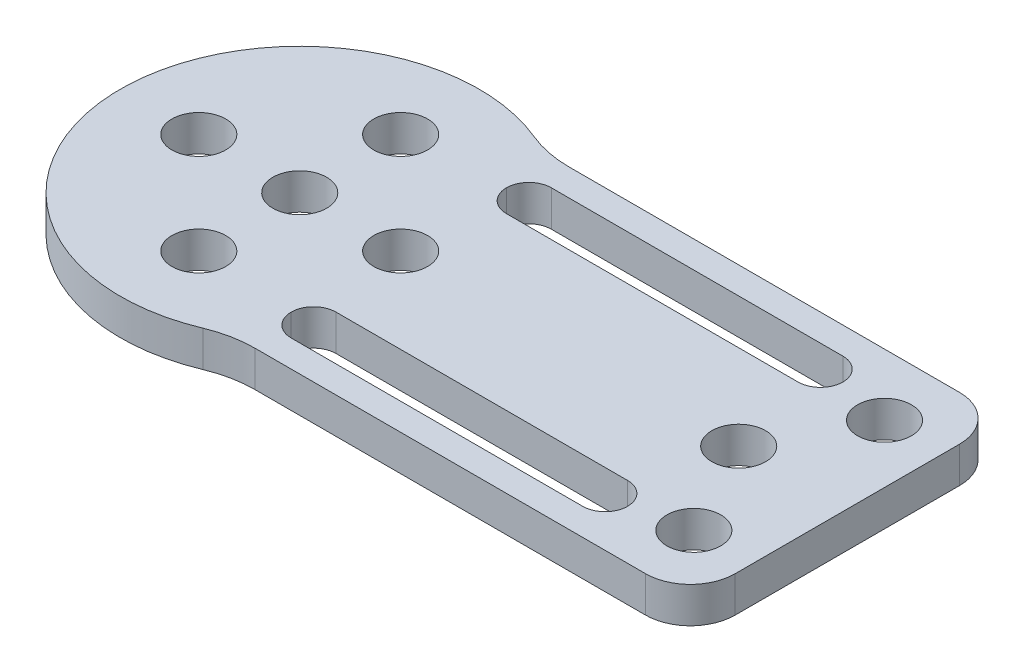
ISO-10303-21;
HEADER;
FILE_DESCRIPTION(('STEP AP214'),'2;1');
FILE_NAME('part.step','',(''),(''),'','','');
FILE_SCHEMA(('AUTOMOTIVE_DESIGN { 1 0 10303 214 1 1 1 1 }'));
ENDSEC;
DATA;
#1=APPLICATION_CONTEXT('core data for automotive mechanical design processes');
#2=APPLICATION_PROTOCOL_DEFINITION('international standard','automotive_design',2000,#1);
#3=PRODUCT_CONTEXT('',#1,'mechanical');
#4=PRODUCT('Part','Part','',(#3));
#5=PRODUCT_RELATED_PRODUCT_CATEGORY('part','',(#4));
#6=PRODUCT_DEFINITION_FORMATION('','',#4);
#7=PRODUCT_DEFINITION_CONTEXT('part definition',#1,'design');
#8=PRODUCT_DEFINITION('design','',#6,#7);
#9=PRODUCT_DEFINITION_SHAPE('','',#8);
#10=(LENGTH_UNIT() NAMED_UNIT(*) SI_UNIT(.MILLI.,.METRE.));
#11=(NAMED_UNIT(*) PLANE_ANGLE_UNIT() SI_UNIT($,.RADIAN.));
#12=(NAMED_UNIT(*) SI_UNIT($,.STERADIAN.) SOLID_ANGLE_UNIT());
#13=UNCERTAINTY_MEASURE_WITH_UNIT(LENGTH_MEASURE(1.E-05),#10,'distance_accuracy_value','');
#14=(GEOMETRIC_REPRESENTATION_CONTEXT(3) GLOBAL_UNCERTAINTY_ASSIGNED_CONTEXT((#13)) GLOBAL_UNIT_ASSIGNED_CONTEXT((#10,
#11,#12)) REPRESENTATION_CONTEXT('',''));
#15=CARTESIAN_POINT('',(0.,0.,0.));
#16=DIRECTION('',(0.,0.,1.));
#17=DIRECTION('',(1.,0.,0.));
#18=AXIS2_PLACEMENT_3D('',#15,#16,#17);
#19=CARTESIAN_POINT('',(11.716387939251,0.8,7.));
#20=DIRECTION('',(-1.,0.,0.));
#21=DIRECTION('',(0.,0.,1.));
#22=AXIS2_PLACEMENT_3D('',#19,#20,#21);
#23=PLANE('',#22);
#24=DIRECTION('',(0.,0.,-1.));
#25=VECTOR('',#24,1.);
#26=CARTESIAN_POINT('',(11.716387939251,-0.8,7.));
#27=LINE('',#26,#25);
#28=CARTESIAN_POINT('',(11.716387939251,-0.8,5.));
#29=VERTEX_POINT('',#28);
#30=CARTESIAN_POINT('',(11.716387939251,-0.8,-5.));
#31=VERTEX_POINT('',#30);
#32=EDGE_CURVE('E199',#29,#31,#27,.T.);
#33=ORIENTED_EDGE('',*,*,#32,.T.);
#34=DIRECTION('',(0.,-1.,0.));
#35=VECTOR('',#34,1.);
#36=CARTESIAN_POINT('',(11.716387939251,0.8,-5.));
#37=LINE('',#36,#35);
#38=CARTESIAN_POINT('',(11.716387939251,0.8,-5.));
#39=VERTEX_POINT('',#38);
#40=EDGE_CURVE('E177',#31,#39,#37,.F.);
#41=ORIENTED_EDGE('',*,*,#40,.T.);
#42=DIRECTION('',(0.,0.,-1.));
#43=VECTOR('',#42,1.);
#44=CARTESIAN_POINT('',(11.716387939251,0.8,7.));
#45=LINE('',#44,#43);
#46=CARTESIAN_POINT('',(11.716387939251,0.8,5.));
#47=VERTEX_POINT('',#46);
#48=EDGE_CURVE('E208',#47,#39,#45,.T.);
#49=ORIENTED_EDGE('',*,*,#48,.F.);
#50=DIRECTION('',(0.,-1.,0.));
#51=VECTOR('',#50,1.);
#52=CARTESIAN_POINT('',(11.716387939251,0.8,5.));
#53=LINE('',#52,#51);
#54=EDGE_CURVE('E182',#47,#29,#53,.T.);
#55=ORIENTED_EDGE('',*,*,#54,.T.);
#56=EDGE_LOOP('',(#33,#41,#49,#55));
#57=FACE_BOUND('',#56,.T.);
#58=ADVANCED_FACE('F33',(#57),#23,.F.);
#59=CARTESIAN_POINT('',(11.716387939251,0.8,-7.));
#60=DIRECTION('',(0.,0.,1.));
#61=DIRECTION('',(1.,0.,0.));
#62=AXIS2_PLACEMENT_3D('',#59,#60,#61);
#63=PLANE('',#62);
#64=DIRECTION('',(-1.,0.,0.));
#65=VECTOR('',#64,1.);
#66=CARTESIAN_POINT('',(11.716387939251,-0.8,-7.));
#67=LINE('',#66,#65);
#68=CARTESIAN_POINT('',(9.71638793925096,-0.8,-7.));
#69=VERTEX_POINT('',#68);
#70=CARTESIAN_POINT('',(-7.7,-0.8,-7.));
#71=VERTEX_POINT('',#70);
#72=EDGE_CURVE('E189',#69,#71,#67,.T.);
#73=ORIENTED_EDGE('',*,*,#72,.T.);
#74=DIRECTION('',(0.,1.,0.));
#75=VECTOR('',#74,1.);
#76=CARTESIAN_POINT('',(-7.7,0.8,-7.));
#77=LINE('',#76,#75);
#78=CARTESIAN_POINT('',(-7.7,0.8,-7.));
#79=VERTEX_POINT('',#78);
#80=EDGE_CURVE('E227',#71,#79,#77,.T.);
#81=ORIENTED_EDGE('',*,*,#80,.T.);
#82=DIRECTION('',(-1.,0.,0.));
#83=VECTOR('',#82,1.);
#84=CARTESIAN_POINT('',(11.716387939251,0.8,-7.));
#85=LINE('',#84,#83);
#86=CARTESIAN_POINT('',(9.71638793925096,0.8,-7.));
#87=VERTEX_POINT('',#86);
#88=EDGE_CURVE('E192',#87,#79,#85,.T.);
#89=ORIENTED_EDGE('',*,*,#88,.F.);
#90=DIRECTION('',(0.,-1.,0.));
#91=VECTOR('',#90,1.);
#92=CARTESIAN_POINT('',(9.71638793925096,0.8,-7.));
#93=LINE('',#92,#91);
#94=EDGE_CURVE('E176',#87,#69,#93,.T.);
#95=ORIENTED_EDGE('',*,*,#94,.T.);
#96=EDGE_LOOP('',(#73,#81,#89,#95));
#97=FACE_BOUND('',#96,.T.);
#98=ADVANCED_FACE('F188',(#97),#63,.F.);
#99=CARTESIAN_POINT('',(-12.7,0.8,0.));
#100=DIRECTION('',(0.,-1.,0.));
#101=DIRECTION('',(0.,0.,-1.));
#102=AXIS2_PLACEMENT_3D('',#99,#100,#101);
#103=CYLINDRICAL_SURFACE('',#102,8.);
#104=CARTESIAN_POINT('',(-12.7,0.8,0.));
#105=DIRECTION('',(0.,1.,0.));
#106=DIRECTION('',(0.,0.,1.));
#107=AXIS2_PLACEMENT_3D('',#104,#105,#106);
#108=CIRCLE('',#107,8.);
#109=CARTESIAN_POINT('',(-9.62307692307692,0.8,-7.38461538461539));
#110=VERTEX_POINT('',#109);
#111=CARTESIAN_POINT('',(-9.62307692307694,0.8,7.38461538461538));
#112=VERTEX_POINT('',#111);
#113=EDGE_CURVE('E383',#110,#112,#108,.T.);
#114=ORIENTED_EDGE('',*,*,#113,.F.);
#115=DIRECTION('',(0.,-1.,0.));
#116=VECTOR('',#115,1.);
#117=CARTESIAN_POINT('',(-9.62307692307692,0.8,-7.38461538461539));
#118=LINE('',#117,#116);
#119=CARTESIAN_POINT('',(-9.62307692307692,-0.8,-7.38461538461539));
#120=VERTEX_POINT('',#119);
#121=EDGE_CURVE('E224',#110,#120,#118,.T.);
#122=ORIENTED_EDGE('',*,*,#121,.T.);
#123=CARTESIAN_POINT('',(-12.7,-0.8,0.));
#124=DIRECTION('',(0.,1.,0.));
#125=DIRECTION('',(0.,0.,1.));
#126=AXIS2_PLACEMENT_3D('',#123,#124,#125);
#127=CIRCLE('',#126,8.);
#128=CARTESIAN_POINT('',(-9.62307692307694,-0.8,7.38461538461538));
#129=VERTEX_POINT('',#128);
#130=EDGE_CURVE('E198',#120,#129,#127,.T.);
#131=ORIENTED_EDGE('',*,*,#130,.T.);
#132=DIRECTION('',(0.,-1.,0.));
#133=VECTOR('',#132,1.);
#134=CARTESIAN_POINT('',(-9.62307692307694,0.8,7.38461538461538));
#135=LINE('',#134,#133);
#136=EDGE_CURVE('E222',#129,#112,#135,.F.);
#137=ORIENTED_EDGE('',*,*,#136,.T.);
#138=EDGE_LOOP('',(#114,#122,#131,#137));
#139=FACE_BOUND('',#138,.T.);
#140=ADVANCED_FACE('F404',(#139),#103,.T.);
#141=CARTESIAN_POINT('',(-8.8270166537926,0.8,7.));
#142=DIRECTION('',(0.,0.,-1.));
#143=DIRECTION('',(-1.,0.,0.));
#144=AXIS2_PLACEMENT_3D('',#141,#142,#143);
#145=PLANE('',#144);
#146=DIRECTION('',(1.,0.,0.));
#147=VECTOR('',#146,1.);
#148=CARTESIAN_POINT('',(-8.8270166537926,0.8,7.));
#149=LINE('',#148,#147);
#150=CARTESIAN_POINT('',(-7.70000000000002,0.8,7.));
#151=VERTEX_POINT('',#150);
#152=CARTESIAN_POINT('',(9.71638793925096,0.8,7.));
#153=VERTEX_POINT('',#152);
#154=EDGE_CURVE('E193',#151,#153,#149,.T.);
#155=ORIENTED_EDGE('',*,*,#154,.F.);
#156=DIRECTION('',(0.,1.,0.));
#157=VECTOR('',#156,1.);
#158=CARTESIAN_POINT('',(-7.70000000000002,-0.8,7.));
#159=LINE('',#158,#157);
#160=CARTESIAN_POINT('',(-7.70000000000002,-0.8,7.));
#161=VERTEX_POINT('',#160);
#162=EDGE_CURVE('E229',#151,#161,#159,.F.);
#163=ORIENTED_EDGE('',*,*,#162,.T.);
#164=DIRECTION('',(1.,0.,0.));
#165=VECTOR('',#164,1.);
#166=CARTESIAN_POINT('',(-8.8270166537926,-0.8,7.));
#167=LINE('',#166,#165);
#168=CARTESIAN_POINT('',(9.71638793925096,-0.8,7.));
#169=VERTEX_POINT('',#168);
#170=EDGE_CURVE('E202',#161,#169,#167,.T.);
#171=ORIENTED_EDGE('',*,*,#170,.T.);
#172=DIRECTION('',(0.,-1.,0.));
#173=VECTOR('',#172,1.);
#174=CARTESIAN_POINT('',(9.71638793925096,0.8,7.));
#175=LINE('',#174,#173);
#176=EDGE_CURVE('E219',#169,#153,#175,.F.);
#177=ORIENTED_EDGE('',*,*,#176,.T.);
#178=EDGE_LOOP('',(#155,#163,#171,#177));
#179=FACE_BOUND('',#178,.T.);
#180=ADVANCED_FACE('F394',(#179),#145,.F.);
#181=CARTESIAN_POINT('',(-12.7,0.8,0.));
#182=DIRECTION('',(0.,1.,0.));
#183=DIRECTION('',(0.,0.,1.));
#184=AXIS2_PLACEMENT_3D('',#181,#182,#183);
#185=PLANE('',#184);
#186=CARTESIAN_POINT('',(-7.28361206074903,0.8,-4.8));
#187=DIRECTION('',(0.,1.,0.));
#188=DIRECTION('',(0.,0.,1.));
#189=AXIS2_PLACEMENT_3D('',#186,#187,#188);
#190=CIRCLE('',#189,1.);
#191=CARTESIAN_POINT('',(-7.28361206074903,0.8,-3.8));
#192=VERTEX_POINT('',#191);
#193=CARTESIAN_POINT('',(-8.28361206074904,0.8,-4.8));
#194=VERTEX_POINT('',#193);
#195=EDGE_CURVE('E275',#192,#194,#190,.F.);
#196=ORIENTED_EDGE('',*,*,#195,.T.);
#197=CARTESIAN_POINT('',(-7.28361206074903,0.8,-4.8));
#198=DIRECTION('',(0.,1.,0.));
#199=DIRECTION('',(0.,0.,1.));
#200=AXIS2_PLACEMENT_3D('',#197,#198,#199);
#201=CIRCLE('',#200,1.);
#202=CARTESIAN_POINT('',(-7.28361206074903,0.8,-5.8));
#203=VERTEX_POINT('',#202);
#204=EDGE_CURVE('E42',#194,#203,#201,.F.);
#205=ORIENTED_EDGE('',*,*,#204,.T.);
#206=DIRECTION('',(-1.,0.,0.));
#207=VECTOR('',#206,1.);
#208=CARTESIAN_POINT('',(-8.28361206074904,0.8,-5.8));
#209=LINE('',#208,#207);
#210=CARTESIAN_POINT('',(5.71638793925096,0.8,-5.8));
#211=VERTEX_POINT('',#210);
#212=EDGE_CURVE('E319',#211,#203,#209,.T.);
#213=ORIENTED_EDGE('',*,*,#212,.F.);
#214=CARTESIAN_POINT('',(5.71638793925096,0.8,-4.8));
#215=DIRECTION('',(0.,1.,0.));
#216=DIRECTION('',(0.,0.,1.));
#217=AXIS2_PLACEMENT_3D('',#214,#215,#216);
#218=CIRCLE('',#217,1.);
#219=CARTESIAN_POINT('',(6.71638793925096,0.8,-4.8));
#220=VERTEX_POINT('',#219);
#221=EDGE_CURVE('E58',#211,#220,#218,.F.);
#222=ORIENTED_EDGE('',*,*,#221,.T.);
#223=CARTESIAN_POINT('',(5.71638793925096,0.8,-4.8));
#224=DIRECTION('',(0.,1.,0.));
#225=DIRECTION('',(0.,0.,1.));
#226=AXIS2_PLACEMENT_3D('',#223,#224,#225);
#227=CIRCLE('',#226,1.);
#228=CARTESIAN_POINT('',(5.71638793925096,0.8,-3.8));
#229=VERTEX_POINT('',#228);
#230=EDGE_CURVE('E279',#220,#229,#227,.F.);
#231=ORIENTED_EDGE('',*,*,#230,.T.);
#232=DIRECTION('',(1.,0.,0.));
#233=VECTOR('',#232,1.);
#234=CARTESIAN_POINT('',(-8.28361206074904,0.8,-3.8));
#235=LINE('',#234,#233);
#236=EDGE_CURVE('E322',#192,#229,#235,.T.);
#237=ORIENTED_EDGE('',*,*,#236,.F.);
#238=EDGE_LOOP('',(#196,#205,#213,#222,#231,#237));
#239=FACE_BOUND('',#238,.T.);
#240=CARTESIAN_POINT('',(-7.28361206074904,0.8,4.8));
#241=DIRECTION('',(0.,1.,0.));
#242=DIRECTION('',(0.,0.,1.));
#243=AXIS2_PLACEMENT_3D('',#240,#241,#242);
#244=CIRCLE('',#243,1.);
#245=CARTESIAN_POINT('',(-7.28361206074904,0.8,5.8));
#246=VERTEX_POINT('',#245);
#247=CARTESIAN_POINT('',(-8.28361206074904,0.8,4.8));
#248=VERTEX_POINT('',#247);
#249=EDGE_CURVE('E259',#246,#248,#244,.F.);
#250=ORIENTED_EDGE('',*,*,#249,.T.);
#251=CARTESIAN_POINT('',(-7.28361206074904,0.8,4.8));
#252=DIRECTION('',(0.,1.,0.));
#253=DIRECTION('',(0.,0.,1.));
#254=AXIS2_PLACEMENT_3D('',#251,#252,#253);
#255=CIRCLE('',#254,1.);
#256=CARTESIAN_POINT('',(-7.28361206074904,0.8,3.8));
#257=VERTEX_POINT('',#256);
#258=EDGE_CURVE('E271',#248,#257,#255,.F.);
#259=ORIENTED_EDGE('',*,*,#258,.T.);
#260=DIRECTION('',(-1.,0.,0.));
#261=VECTOR('',#260,1.);
#262=CARTESIAN_POINT('',(-8.28361206074904,0.8,3.8));
#263=LINE('',#262,#261);
#264=CARTESIAN_POINT('',(5.71638793925096,0.8,3.8));
#265=VERTEX_POINT('',#264);
#266=EDGE_CURVE('E330',#265,#257,#263,.T.);
#267=ORIENTED_EDGE('',*,*,#266,.F.);
#268=CARTESIAN_POINT('',(5.71638793925096,0.8,4.8));
#269=DIRECTION('',(0.,1.,0.));
#270=DIRECTION('',(0.,0.,1.));
#271=AXIS2_PLACEMENT_3D('',#268,#269,#270);
#272=CIRCLE('',#271,1.);
#273=CARTESIAN_POINT('',(6.71638793925096,0.8,4.8));
#274=VERTEX_POINT('',#273);
#275=EDGE_CURVE('E267',#265,#274,#272,.F.);
#276=ORIENTED_EDGE('',*,*,#275,.T.);
#277=CARTESIAN_POINT('',(5.71638793925096,0.8,4.8));
#278=DIRECTION('',(0.,1.,0.));
#279=DIRECTION('',(0.,0.,1.));
#280=AXIS2_PLACEMENT_3D('',#277,#278,#279);
#281=CIRCLE('',#280,1.);
#282=CARTESIAN_POINT('',(5.71638793925096,0.8,5.8));
#283=VERTEX_POINT('',#282);
#284=EDGE_CURVE('E263',#274,#283,#281,.F.);
#285=ORIENTED_EDGE('',*,*,#284,.T.);
#286=DIRECTION('',(1.,0.,0.));
#287=VECTOR('',#286,1.);
#288=CARTESIAN_POINT('',(-8.28361206074904,0.8,5.8));
#289=LINE('',#288,#287);
#290=EDGE_CURVE('E289',#246,#283,#289,.T.);
#291=ORIENTED_EDGE('',*,*,#290,.F.);
#292=EDGE_LOOP('',(#250,#259,#267,#276,#285,#291));
#293=FACE_BOUND('',#292,.T.);
#294=CARTESIAN_POINT('',(9.12138793925096,0.8,-4.25));
#295=DIRECTION('',(0.,1.,0.));
#296=DIRECTION('',(0.,0.,1.));
#297=AXIS2_PLACEMENT_3D('',#294,#295,#296);
#298=CIRCLE('',#297,1.2);
#299=CARTESIAN_POINT('',(9.12138793925096,0.8,-3.05));
#300=VERTEX_POINT('',#299);
#301=EDGE_CURVE('E341',#300,#300,#298,.T.);
#302=ORIENTED_EDGE('',*,*,#301,.F.);
#303=EDGE_LOOP('',(#302));
#304=FACE_BOUND('',#303,.T.);
#305=CARTESIAN_POINT('',(9.12138793925097,0.8,4.25));
#306=DIRECTION('',(0.,1.,0.));
#307=DIRECTION('',(0.,0.,1.));
#308=AXIS2_PLACEMENT_3D('',#305,#306,#307);
#309=CIRCLE('',#308,1.2);
#310=CARTESIAN_POINT('',(9.12138793925097,0.8,5.45));
#311=VERTEX_POINT('',#310);
#312=EDGE_CURVE('E347',#311,#311,#309,.T.);
#313=ORIENTED_EDGE('',*,*,#312,.F.);
#314=EDGE_LOOP('',(#313));
#315=FACE_BOUND('',#314,.T.);
#316=CARTESIAN_POINT('',(6.87138793925096,0.8,0.));
#317=DIRECTION('',(0.,1.,0.));
#318=DIRECTION('',(0.,0.,1.));
#319=AXIS2_PLACEMENT_3D('',#316,#317,#318);
#320=CIRCLE('',#319,1.2);
#321=CARTESIAN_POINT('',(6.87138793925096,0.8,1.2));
#322=VERTEX_POINT('',#321);
#323=EDGE_CURVE('E313',#322,#322,#320,.T.);
#324=ORIENTED_EDGE('',*,*,#323,.F.);
#325=EDGE_LOOP('',(#324));
#326=FACE_BOUND('',#325,.T.);
#327=CARTESIAN_POINT('',(-8.2,0.8,0.));
#328=DIRECTION('',(0.,1.,0.));
#329=DIRECTION('',(0.,0.,1.));
#330=AXIS2_PLACEMENT_3D('',#327,#328,#329);
#331=CIRCLE('',#330,1.2);
#332=CARTESIAN_POINT('',(-8.2,0.8,1.2));
#333=VERTEX_POINT('',#332);
#334=EDGE_CURVE('E354',#333,#333,#331,.T.);
#335=ORIENTED_EDGE('',*,*,#334,.F.);
#336=EDGE_LOOP('',(#335));
#337=FACE_BOUND('',#336,.T.);
#338=CARTESIAN_POINT('',(-12.7,0.8,0.));
#339=DIRECTION('',(0.,1.,0.));
#340=DIRECTION('',(0.,0.,1.));
#341=AXIS2_PLACEMENT_3D('',#338,#339,#340);
#342=CIRCLE('',#341,1.2);
#343=CARTESIAN_POINT('',(-12.7,0.8,1.2));
#344=VERTEX_POINT('',#343);
#345=EDGE_CURVE('E340',#344,#344,#342,.T.);
#346=ORIENTED_EDGE('',*,*,#345,.F.);
#347=EDGE_LOOP('',(#346));
#348=FACE_BOUND('',#347,.T.);
#349=CARTESIAN_POINT('',(-12.7,0.8,4.5));
#350=DIRECTION('',(0.,1.,0.));
#351=DIRECTION('',(0.,0.,1.));
#352=AXIS2_PLACEMENT_3D('',#349,#350,#351);
#353=CIRCLE('',#352,1.2);
#354=CARTESIAN_POINT('',(-12.7,0.8,5.7));
#355=VERTEX_POINT('',#354);
#356=EDGE_CURVE('E362',#355,#355,#353,.T.);
#357=ORIENTED_EDGE('',*,*,#356,.F.);
#358=EDGE_LOOP('',(#357));
#359=FACE_BOUND('',#358,.T.);
#360=CARTESIAN_POINT('',(-17.2,0.8,0.));
#361=DIRECTION('',(0.,1.,0.));
#362=DIRECTION('',(0.,0.,1.));
#363=AXIS2_PLACEMENT_3D('',#360,#361,#362);
#364=CIRCLE('',#363,1.2);
#365=CARTESIAN_POINT('',(-17.2,0.8,1.2));
#366=VERTEX_POINT('',#365);
#367=EDGE_CURVE('E361',#366,#366,#364,.T.);
#368=ORIENTED_EDGE('',*,*,#367,.F.);
#369=EDGE_LOOP('',(#368));
#370=FACE_BOUND('',#369,.T.);
#371=CARTESIAN_POINT('',(-12.7,0.8,-4.5));
#372=DIRECTION('',(0.,1.,0.));
#373=DIRECTION('',(0.,0.,1.));
#374=AXIS2_PLACEMENT_3D('',#371,#372,#373);
#375=CIRCLE('',#374,1.2);
#376=CARTESIAN_POINT('',(-12.7,0.8,-3.3));
#377=VERTEX_POINT('',#376);
#378=EDGE_CURVE('E372',#377,#377,#375,.T.);
#379=ORIENTED_EDGE('',*,*,#378,.F.);
#380=EDGE_LOOP('',(#379));
#381=FACE_BOUND('',#380,.T.);
#382=ORIENTED_EDGE('',*,*,#48,.T.);
#383=CARTESIAN_POINT('',(9.71638793925096,0.8,-5.));
#384=DIRECTION('',(0.,1.,0.));
#385=DIRECTION('',(0.,0.,1.));
#386=AXIS2_PLACEMENT_3D('',#383,#384,#385);
#387=CIRCLE('',#386,2.);
#388=EDGE_CURVE('E217',#39,#87,#387,.T.);
#389=ORIENTED_EDGE('',*,*,#388,.T.);
#390=ORIENTED_EDGE('',*,*,#88,.T.);
#391=CARTESIAN_POINT('',(-7.7,0.8,-12.));
#392=DIRECTION('',(0.,1.,0.));
#393=DIRECTION('',(0.,0.,1.));
#394=AXIS2_PLACEMENT_3D('',#391,#392,#393);
#395=CIRCLE('',#394,5.);
#396=EDGE_CURVE('E233',#79,#110,#395,.F.);
#397=ORIENTED_EDGE('',*,*,#396,.T.);
#398=ORIENTED_EDGE('',*,*,#113,.T.);
#399=CARTESIAN_POINT('',(-7.70000000000002,0.8,12.));
#400=DIRECTION('',(0.,1.,0.));
#401=DIRECTION('',(0.,0.,1.));
#402=AXIS2_PLACEMENT_3D('',#399,#400,#401);
#403=CIRCLE('',#402,5.);
#404=EDGE_CURVE('E237',#112,#151,#403,.F.);
#405=ORIENTED_EDGE('',*,*,#404,.T.);
#406=ORIENTED_EDGE('',*,*,#154,.T.);
#407=CARTESIAN_POINT('',(9.71638793925096,0.8,5.));
#408=DIRECTION('',(0.,1.,0.));
#409=DIRECTION('',(0.,0.,1.));
#410=AXIS2_PLACEMENT_3D('',#407,#408,#409);
#411=CIRCLE('',#410,2.);
#412=EDGE_CURVE('E215',#153,#47,#411,.T.);
#413=ORIENTED_EDGE('',*,*,#412,.T.);
#414=EDGE_LOOP('',(#382,#389,#390,#397,#398,#405,#406,#413));
#415=FACE_BOUND('',#414,.T.);
#416=ADVANCED_FACE('F387',(#239,#293,#304,#315,#326,#337,#348,#359,#370,#381,#415),#185,.T.);
#417=CARTESIAN_POINT('',(-12.7,-0.8,0.));
#418=DIRECTION('',(0.,1.,0.));
#419=DIRECTION('',(0.,0.,1.));
#420=AXIS2_PLACEMENT_3D('',#417,#418,#419);
#421=PLANE('',#420);
#422=CARTESIAN_POINT('',(5.71638793925096,-0.8,-4.8));
#423=DIRECTION('',(0.,1.,0.));
#424=DIRECTION('',(0.,0.,1.));
#425=AXIS2_PLACEMENT_3D('',#422,#423,#424);
#426=CIRCLE('',#425,1.);
#427=CARTESIAN_POINT('',(5.71638793925096,-0.8,-3.8));
#428=VERTEX_POINT('',#427);
#429=CARTESIAN_POINT('',(6.71638793925096,-0.8,-4.8));
#430=VERTEX_POINT('',#429);
#431=EDGE_CURVE('E50',#428,#430,#426,.T.);
#432=ORIENTED_EDGE('',*,*,#431,.T.);
#433=CARTESIAN_POINT('',(5.71638793925096,-0.8,-4.8));
#434=DIRECTION('',(0.,1.,0.));
#435=DIRECTION('',(0.,0.,1.));
#436=AXIS2_PLACEMENT_3D('',#433,#434,#435);
#437=CIRCLE('',#436,1.);
#438=CARTESIAN_POINT('',(5.71638793925096,-0.8,-5.8));
#439=VERTEX_POINT('',#438);
#440=EDGE_CURVE('E283',#430,#439,#437,.T.);
#441=ORIENTED_EDGE('',*,*,#440,.T.);
#442=DIRECTION('',(-1.,0.,0.));
#443=VECTOR('',#442,1.);
#444=CARTESIAN_POINT('',(-8.28361206074904,-0.8,-5.8));
#445=LINE('',#444,#443);
#446=CARTESIAN_POINT('',(-7.28361206074903,-0.8,-5.8));
#447=VERTEX_POINT('',#446);
#448=EDGE_CURVE('E307',#439,#447,#445,.T.);
#449=ORIENTED_EDGE('',*,*,#448,.T.);
#450=CARTESIAN_POINT('',(-7.28361206074903,-0.8,-4.8));
#451=DIRECTION('',(0.,1.,0.));
#452=DIRECTION('',(0.,0.,1.));
#453=AXIS2_PLACEMENT_3D('',#450,#451,#452);
#454=CIRCLE('',#453,1.);
#455=CARTESIAN_POINT('',(-8.28361206074904,-0.8,-4.8));
#456=VERTEX_POINT('',#455);
#457=EDGE_CURVE('E11',#447,#456,#454,.T.);
#458=ORIENTED_EDGE('',*,*,#457,.T.);
#459=CARTESIAN_POINT('',(-7.28361206074903,-0.8,-4.8));
#460=DIRECTION('',(0.,1.,0.));
#461=DIRECTION('',(0.,0.,1.));
#462=AXIS2_PLACEMENT_3D('',#459,#460,#461);
#463=CIRCLE('',#462,1.);
#464=CARTESIAN_POINT('',(-7.28361206074903,-0.8,-3.8));
#465=VERTEX_POINT('',#464);
#466=EDGE_CURVE('E277',#456,#465,#463,.T.);
#467=ORIENTED_EDGE('',*,*,#466,.T.);
#468=DIRECTION('',(1.,0.,0.));
#469=VECTOR('',#468,1.);
#470=CARTESIAN_POINT('',(-8.28361206074904,-0.8,-3.8));
#471=LINE('',#470,#469);
#472=EDGE_CURVE('E314',#465,#428,#471,.T.);
#473=ORIENTED_EDGE('',*,*,#472,.T.);
#474=EDGE_LOOP('',(#432,#441,#449,#458,#467,#473));
#475=FACE_BOUND('',#474,.T.);
#476=CARTESIAN_POINT('',(5.71638793925096,-0.8,4.8));
#477=DIRECTION('',(0.,1.,0.));
#478=DIRECTION('',(0.,0.,1.));
#479=AXIS2_PLACEMENT_3D('',#476,#477,#478);
#480=CIRCLE('',#479,1.);
#481=CARTESIAN_POINT('',(5.71638793925096,-0.8,5.8));
#482=VERTEX_POINT('',#481);
#483=CARTESIAN_POINT('',(6.71638793925096,-0.8,4.8));
#484=VERTEX_POINT('',#483);
#485=EDGE_CURVE('E265',#482,#484,#480,.T.);
#486=ORIENTED_EDGE('',*,*,#485,.T.);
#487=CARTESIAN_POINT('',(5.71638793925096,-0.8,4.8));
#488=DIRECTION('',(0.,1.,0.));
#489=DIRECTION('',(0.,0.,1.));
#490=AXIS2_PLACEMENT_3D('',#487,#488,#489);
#491=CIRCLE('',#490,1.);
#492=CARTESIAN_POINT('',(5.71638793925096,-0.8,3.8));
#493=VERTEX_POINT('',#492);
#494=EDGE_CURVE('E269',#484,#493,#491,.T.);
#495=ORIENTED_EDGE('',*,*,#494,.T.);
#496=DIRECTION('',(-1.,0.,0.));
#497=VECTOR('',#496,1.);
#498=CARTESIAN_POINT('',(-8.28361206074904,-0.8,3.8));
#499=LINE('',#498,#497);
#500=CARTESIAN_POINT('',(-7.28361206074904,-0.8,3.8));
#501=VERTEX_POINT('',#500);
#502=EDGE_CURVE('E325',#493,#501,#499,.T.);
#503=ORIENTED_EDGE('',*,*,#502,.T.);
#504=CARTESIAN_POINT('',(-7.28361206074904,-0.8,4.8));
#505=DIRECTION('',(0.,1.,0.));
#506=DIRECTION('',(0.,0.,1.));
#507=AXIS2_PLACEMENT_3D('',#504,#505,#506);
#508=CIRCLE('',#507,1.);
#509=CARTESIAN_POINT('',(-8.28361206074904,-0.8,4.8));
#510=VERTEX_POINT('',#509);
#511=EDGE_CURVE('E273',#501,#510,#508,.T.);
#512=ORIENTED_EDGE('',*,*,#511,.T.);
#513=CARTESIAN_POINT('',(-7.28361206074904,-0.8,4.8));
#514=DIRECTION('',(0.,1.,0.));
#515=DIRECTION('',(0.,0.,1.));
#516=AXIS2_PLACEMENT_3D('',#513,#514,#515);
#517=CIRCLE('',#516,1.);
#518=CARTESIAN_POINT('',(-7.28361206074904,-0.8,5.8));
#519=VERTEX_POINT('',#518);
#520=EDGE_CURVE('E261',#510,#519,#517,.T.);
#521=ORIENTED_EDGE('',*,*,#520,.T.);
#522=DIRECTION('',(1.,0.,0.));
#523=VECTOR('',#522,1.);
#524=CARTESIAN_POINT('',(-8.28361206074904,-0.8,5.8));
#525=LINE('',#524,#523);
#526=EDGE_CURVE('E327',#519,#482,#525,.T.);
#527=ORIENTED_EDGE('',*,*,#526,.T.);
#528=EDGE_LOOP('',(#486,#495,#503,#512,#521,#527));
#529=FACE_BOUND('',#528,.T.);
#530=CARTESIAN_POINT('',(9.12138793925096,-0.8,-4.25));
#531=DIRECTION('',(0.,1.,0.));
#532=DIRECTION('',(0.,0.,1.));
#533=AXIS2_PLACEMENT_3D('',#530,#531,#532);
#534=CIRCLE('',#533,1.2);
#535=CARTESIAN_POINT('',(9.12138793925096,-0.8,-3.05));
#536=VERTEX_POINT('',#535);
#537=EDGE_CURVE('E337',#536,#536,#534,.T.);
#538=ORIENTED_EDGE('',*,*,#537,.T.);
#539=EDGE_LOOP('',(#538));
#540=FACE_BOUND('',#539,.T.);
#541=CARTESIAN_POINT('',(9.12138793925097,-0.8,4.25));
#542=DIRECTION('',(0.,1.,0.));
#543=DIRECTION('',(0.,0.,1.));
#544=AXIS2_PLACEMENT_3D('',#541,#542,#543);
#545=CIRCLE('',#544,1.2);
#546=CARTESIAN_POINT('',(9.12138793925097,-0.8,5.45));
#547=VERTEX_POINT('',#546);
#548=EDGE_CURVE('E344',#547,#547,#545,.T.);
#549=ORIENTED_EDGE('',*,*,#548,.T.);
#550=EDGE_LOOP('',(#549));
#551=FACE_BOUND('',#550,.T.);
#552=CARTESIAN_POINT('',(6.87138793925096,-0.8,0.));
#553=DIRECTION('',(0.,1.,0.));
#554=DIRECTION('',(0.,0.,1.));
#555=AXIS2_PLACEMENT_3D('',#552,#553,#554);
#556=CIRCLE('',#555,1.2);
#557=CARTESIAN_POINT('',(6.87138793925096,-0.8,1.2));
#558=VERTEX_POINT('',#557);
#559=EDGE_CURVE('E317',#558,#558,#556,.T.);
#560=ORIENTED_EDGE('',*,*,#559,.T.);
#561=EDGE_LOOP('',(#560));
#562=FACE_BOUND('',#561,.T.);
#563=CARTESIAN_POINT('',(-8.2,-0.8,0.));
#564=DIRECTION('',(0.,1.,0.));
#565=DIRECTION('',(0.,0.,1.));
#566=AXIS2_PLACEMENT_3D('',#563,#564,#565);
#567=CIRCLE('',#566,1.2);
#568=CARTESIAN_POINT('',(-8.2,-0.8,1.2));
#569=VERTEX_POINT('',#568);
#570=EDGE_CURVE('E204',#569,#569,#567,.T.);
#571=ORIENTED_EDGE('',*,*,#570,.T.);
#572=EDGE_LOOP('',(#571));
#573=FACE_BOUND('',#572,.T.);
#574=CARTESIAN_POINT('',(-12.7,-0.8,0.));
#575=DIRECTION('',(0.,1.,0.));
#576=DIRECTION('',(0.,0.,1.));
#577=AXIS2_PLACEMENT_3D('',#574,#575,#576);
#578=CIRCLE('',#577,1.2);
#579=CARTESIAN_POINT('',(-12.7,-0.8,1.2));
#580=VERTEX_POINT('',#579);
#581=EDGE_CURVE('E365',#580,#580,#578,.T.);
#582=ORIENTED_EDGE('',*,*,#581,.T.);
#583=EDGE_LOOP('',(#582));
#584=FACE_BOUND('',#583,.T.);
#585=CARTESIAN_POINT('',(-12.7,-0.8,4.5));
#586=DIRECTION('',(0.,1.,0.));
#587=DIRECTION('',(0.,0.,1.));
#588=AXIS2_PLACEMENT_3D('',#585,#586,#587);
#589=CIRCLE('',#588,1.2);
#590=CARTESIAN_POINT('',(-12.7,-0.8,5.7));
#591=VERTEX_POINT('',#590);
#592=EDGE_CURVE('E358',#591,#591,#589,.T.);
#593=ORIENTED_EDGE('',*,*,#592,.T.);
#594=EDGE_LOOP('',(#593));
#595=FACE_BOUND('',#594,.T.);
#596=CARTESIAN_POINT('',(-17.2,-0.8,0.));
#597=DIRECTION('',(0.,1.,0.));
#598=DIRECTION('',(0.,0.,1.));
#599=AXIS2_PLACEMENT_3D('',#596,#597,#598);
#600=CIRCLE('',#599,1.2);
#601=CARTESIAN_POINT('',(-17.2,-0.8,1.2));
#602=VERTEX_POINT('',#601);
#603=EDGE_CURVE('E375',#602,#602,#600,.T.);
#604=ORIENTED_EDGE('',*,*,#603,.T.);
#605=EDGE_LOOP('',(#604));
#606=FACE_BOUND('',#605,.T.);
#607=CARTESIAN_POINT('',(-12.7,-0.8,-4.5));
#608=DIRECTION('',(0.,1.,0.));
#609=DIRECTION('',(0.,0.,1.));
#610=AXIS2_PLACEMENT_3D('',#607,#608,#609);
#611=CIRCLE('',#610,1.2);
#612=CARTESIAN_POINT('',(-12.7,-0.8,-3.3));
#613=VERTEX_POINT('',#612);
#614=EDGE_CURVE('E357',#613,#613,#611,.T.);
#615=ORIENTED_EDGE('',*,*,#614,.T.);
#616=EDGE_LOOP('',(#615));
#617=FACE_BOUND('',#616,.T.);
#618=ORIENTED_EDGE('',*,*,#72,.F.);
#619=CARTESIAN_POINT('',(9.71638793925096,-0.8,-5.));
#620=DIRECTION('',(0.,1.,0.));
#621=DIRECTION('',(0.,0.,1.));
#622=AXIS2_PLACEMENT_3D('',#619,#620,#621);
#623=CIRCLE('',#622,2.);
#624=EDGE_CURVE('E172',#69,#31,#623,.F.);
#625=ORIENTED_EDGE('',*,*,#624,.T.);
#626=ORIENTED_EDGE('',*,*,#32,.F.);
#627=CARTESIAN_POINT('',(9.71638793925096,-0.8,5.));
#628=DIRECTION('',(0.,1.,0.));
#629=DIRECTION('',(0.,0.,1.));
#630=AXIS2_PLACEMENT_3D('',#627,#628,#629);
#631=CIRCLE('',#630,2.);
#632=EDGE_CURVE('E183',#29,#169,#631,.F.);
#633=ORIENTED_EDGE('',*,*,#632,.T.);
#634=ORIENTED_EDGE('',*,*,#170,.F.);
#635=CARTESIAN_POINT('',(-7.70000000000002,-0.8,12.));
#636=DIRECTION('',(0.,1.,0.));
#637=DIRECTION('',(0.,0.,1.));
#638=AXIS2_PLACEMENT_3D('',#635,#636,#637);
#639=CIRCLE('',#638,5.);
#640=EDGE_CURVE('E235',#161,#129,#639,.T.);
#641=ORIENTED_EDGE('',*,*,#640,.T.);
#642=ORIENTED_EDGE('',*,*,#130,.F.);
#643=CARTESIAN_POINT('',(-7.7,-0.8,-12.));
#644=DIRECTION('',(0.,1.,0.));
#645=DIRECTION('',(0.,0.,1.));
#646=AXIS2_PLACEMENT_3D('',#643,#644,#645);
#647=CIRCLE('',#646,5.);
#648=EDGE_CURVE('E197',#120,#71,#647,.T.);
#649=ORIENTED_EDGE('',*,*,#648,.T.);
#650=EDGE_LOOP('',(#618,#625,#626,#633,#634,#641,#642,#649));
#651=FACE_BOUND('',#650,.T.);
#652=ADVANCED_FACE('F195',(#475,#529,#540,#551,#562,#573,#584,#595,#606,#617,#651),#421,.F.);
#653=CARTESIAN_POINT('',(9.71638793925096,0.8,-5.));
#654=DIRECTION('',(0.,-1.,0.));
#655=DIRECTION('',(0.,0.,-1.));
#656=AXIS2_PLACEMENT_3D('',#653,#654,#655);
#657=CYLINDRICAL_SURFACE('',#656,2.);
#658=ORIENTED_EDGE('',*,*,#388,.F.);
#659=ORIENTED_EDGE('',*,*,#40,.F.);
#660=ORIENTED_EDGE('',*,*,#624,.F.);
#661=ORIENTED_EDGE('',*,*,#94,.F.);
#662=EDGE_LOOP('',(#658,#659,#660,#661));
#663=FACE_BOUND('',#662,.T.);
#664=ADVANCED_FACE('F175',(#663),#657,.T.);
#665=CARTESIAN_POINT('',(9.71638793925096,0.8,5.));
#666=DIRECTION('',(0.,-1.,0.));
#667=DIRECTION('',(0.,0.,-1.));
#668=AXIS2_PLACEMENT_3D('',#665,#666,#667);
#669=CYLINDRICAL_SURFACE('',#668,2.);
#670=ORIENTED_EDGE('',*,*,#412,.F.);
#671=ORIENTED_EDGE('',*,*,#176,.F.);
#672=ORIENTED_EDGE('',*,*,#632,.F.);
#673=ORIENTED_EDGE('',*,*,#54,.F.);
#674=EDGE_LOOP('',(#670,#671,#672,#673));
#675=FACE_BOUND('',#674,.T.);
#676=ADVANCED_FACE('F398',(#675),#669,.T.);
#677=CARTESIAN_POINT('',(-7.7,0.8,-12.));
#678=DIRECTION('',(0.,-1.,0.));
#679=DIRECTION('',(0.,0.,-1.));
#680=AXIS2_PLACEMENT_3D('',#677,#678,#679);
#681=CYLINDRICAL_SURFACE('',#680,5.);
#682=ORIENTED_EDGE('',*,*,#396,.F.);
#683=ORIENTED_EDGE('',*,*,#80,.F.);
#684=ORIENTED_EDGE('',*,*,#648,.F.);
#685=ORIENTED_EDGE('',*,*,#121,.F.);
#686=EDGE_LOOP('',(#682,#683,#684,#685));
#687=FACE_BOUND('',#686,.T.);
#688=ADVANCED_FACE('F409',(#687),#681,.F.);
#689=CARTESIAN_POINT('',(-7.70000000000002,0.8,12.));
#690=DIRECTION('',(0.,-1.,0.));
#691=DIRECTION('',(0.,0.,-1.));
#692=AXIS2_PLACEMENT_3D('',#689,#690,#691);
#693=CYLINDRICAL_SURFACE('',#692,5.);
#694=ORIENTED_EDGE('',*,*,#404,.F.);
#695=ORIENTED_EDGE('',*,*,#136,.F.);
#696=ORIENTED_EDGE('',*,*,#640,.F.);
#697=ORIENTED_EDGE('',*,*,#162,.F.);
#698=EDGE_LOOP('',(#694,#695,#696,#697));
#699=FACE_BOUND('',#698,.T.);
#700=ADVANCED_FACE('F406',(#699),#693,.F.);
#701=CARTESIAN_POINT('',(-12.7,-0.8,-4.5));
#702=DIRECTION('',(0.,1.,0.));
#703=DIRECTION('',(0.,0.,1.));
#704=AXIS2_PLACEMENT_3D('',#701,#702,#703);
#705=CYLINDRICAL_SURFACE('',#704,1.2);
#706=ORIENTED_EDGE('',*,*,#614,.F.);
#707=EDGE_LOOP('',(#706));
#708=FACE_BOUND('',#707,.T.);
#709=ORIENTED_EDGE('',*,*,#378,.T.);
#710=EDGE_LOOP('',(#709));
#711=FACE_BOUND('',#710,.T.);
#712=ADVANCED_FACE('F408',(#708,#711),#705,.F.);
#713=CARTESIAN_POINT('',(-17.2,-0.8,0.));
#714=DIRECTION('',(0.,1.,0.));
#715=DIRECTION('',(0.,0.,1.));
#716=AXIS2_PLACEMENT_3D('',#713,#714,#715);
#717=CYLINDRICAL_SURFACE('',#716,1.2);
#718=ORIENTED_EDGE('',*,*,#603,.F.);
#719=EDGE_LOOP('',(#718));
#720=FACE_BOUND('',#719,.T.);
#721=ORIENTED_EDGE('',*,*,#367,.T.);
#722=EDGE_LOOP('',(#721));
#723=FACE_BOUND('',#722,.T.);
#724=ADVANCED_FACE('F415',(#720,#723),#717,.F.);
#725=CARTESIAN_POINT('',(-12.7,-0.8,4.5));
#726=DIRECTION('',(0.,1.,0.));
#727=DIRECTION('',(0.,0.,1.));
#728=AXIS2_PLACEMENT_3D('',#725,#726,#727);
#729=CYLINDRICAL_SURFACE('',#728,1.2);
#730=ORIENTED_EDGE('',*,*,#592,.F.);
#731=EDGE_LOOP('',(#730));
#732=FACE_BOUND('',#731,.T.);
#733=ORIENTED_EDGE('',*,*,#356,.T.);
#734=EDGE_LOOP('',(#733));
#735=FACE_BOUND('',#734,.T.);
#736=ADVANCED_FACE('F466',(#732,#735),#729,.F.);
#737=CARTESIAN_POINT('',(-12.7,-0.8,0.));
#738=DIRECTION('',(0.,1.,0.));
#739=DIRECTION('',(0.,0.,1.));
#740=AXIS2_PLACEMENT_3D('',#737,#738,#739);
#741=CYLINDRICAL_SURFACE('',#740,1.2);
#742=ORIENTED_EDGE('',*,*,#581,.F.);
#743=EDGE_LOOP('',(#742));
#744=FACE_BOUND('',#743,.T.);
#745=ORIENTED_EDGE('',*,*,#345,.T.);
#746=EDGE_LOOP('',(#745));
#747=FACE_BOUND('',#746,.T.);
#748=ADVANCED_FACE('F476',(#744,#747),#741,.F.);
#749=CARTESIAN_POINT('',(-8.2,-0.8,0.));
#750=DIRECTION('',(0.,1.,0.));
#751=DIRECTION('',(0.,0.,1.));
#752=AXIS2_PLACEMENT_3D('',#749,#750,#751);
#753=CYLINDRICAL_SURFACE('',#752,1.2);
#754=ORIENTED_EDGE('',*,*,#570,.F.);
#755=EDGE_LOOP('',(#754));
#756=FACE_BOUND('',#755,.T.);
#757=ORIENTED_EDGE('',*,*,#334,.T.);
#758=EDGE_LOOP('',(#757));
#759=FACE_BOUND('',#758,.T.);
#760=ADVANCED_FACE('F486',(#756,#759),#753,.F.);
#761=CARTESIAN_POINT('',(6.87138793925096,-0.8,0.));
#762=DIRECTION('',(0.,1.,0.));
#763=DIRECTION('',(0.,0.,1.));
#764=AXIS2_PLACEMENT_3D('',#761,#762,#763);
#765=CYLINDRICAL_SURFACE('',#764,1.2);
#766=ORIENTED_EDGE('',*,*,#559,.F.);
#767=EDGE_LOOP('',(#766));
#768=FACE_BOUND('',#767,.T.);
#769=ORIENTED_EDGE('',*,*,#323,.T.);
#770=EDGE_LOOP('',(#769));
#771=FACE_BOUND('',#770,.T.);
#772=ADVANCED_FACE('F496',(#768,#771),#765,.F.);
#773=CARTESIAN_POINT('',(9.12138793925097,-0.8,4.25));
#774=DIRECTION('',(0.,1.,0.));
#775=DIRECTION('',(0.,0.,1.));
#776=AXIS2_PLACEMENT_3D('',#773,#774,#775);
#777=CYLINDRICAL_SURFACE('',#776,1.2);
#778=ORIENTED_EDGE('',*,*,#548,.F.);
#779=EDGE_LOOP('',(#778));
#780=FACE_BOUND('',#779,.T.);
#781=ORIENTED_EDGE('',*,*,#312,.T.);
#782=EDGE_LOOP('',(#781));
#783=FACE_BOUND('',#782,.T.);
#784=ADVANCED_FACE('F506',(#780,#783),#777,.F.);
#785=CARTESIAN_POINT('',(9.12138793925096,-0.8,-4.25));
#786=DIRECTION('',(0.,1.,0.));
#787=DIRECTION('',(0.,0.,1.));
#788=AXIS2_PLACEMENT_3D('',#785,#786,#787);
#789=CYLINDRICAL_SURFACE('',#788,1.2);
#790=ORIENTED_EDGE('',*,*,#537,.F.);
#791=EDGE_LOOP('',(#790));
#792=FACE_BOUND('',#791,.T.);
#793=ORIENTED_EDGE('',*,*,#301,.T.);
#794=EDGE_LOOP('',(#793));
#795=FACE_BOUND('',#794,.T.);
#796=ADVANCED_FACE('F516',(#792,#795),#789,.F.);
#797=CARTESIAN_POINT('',(-8.28361206074904,-0.8,3.8));
#798=DIRECTION('',(0.,0.,-1.));
#799=DIRECTION('',(-1.,0.,0.));
#800=AXIS2_PLACEMENT_3D('',#797,#798,#799);
#801=PLANE('',#800);
#802=ORIENTED_EDGE('',*,*,#502,.F.);
#803=DIRECTION('',(0.,1.,0.));
#804=VECTOR('',#803,1.);
#805=CARTESIAN_POINT('',(5.71638793925096,0.8,3.8));
#806=LINE('',#805,#804);
#807=EDGE_CURVE('E247',#493,#265,#806,.T.);
#808=ORIENTED_EDGE('',*,*,#807,.T.);
#809=ORIENTED_EDGE('',*,*,#266,.T.);
#810=DIRECTION('',(0.,1.,0.));
#811=VECTOR('',#810,1.);
#812=CARTESIAN_POINT('',(-7.28361206074904,-0.8,3.8));
#813=LINE('',#812,#811);
#814=EDGE_CURVE('E245',#257,#501,#813,.F.);
#815=ORIENTED_EDGE('',*,*,#814,.T.);
#816=EDGE_LOOP('',(#802,#808,#809,#815));
#817=FACE_BOUND('',#816,.T.);
#818=ADVANCED_FACE('F526',(#817),#801,.F.);
#819=CARTESIAN_POINT('',(-8.28361206074904,-0.8,5.8));
#820=DIRECTION('',(0.,0.,1.));
#821=DIRECTION('',(1.,0.,0.));
#822=AXIS2_PLACEMENT_3D('',#819,#820,#821);
#823=PLANE('',#822);
#824=ORIENTED_EDGE('',*,*,#526,.F.);
#825=DIRECTION('',(0.,1.,0.));
#826=VECTOR('',#825,1.);
#827=CARTESIAN_POINT('',(-7.28361206074904,0.8,5.8));
#828=LINE('',#827,#826);
#829=EDGE_CURVE('E242',#519,#246,#828,.T.);
#830=ORIENTED_EDGE('',*,*,#829,.T.);
#831=ORIENTED_EDGE('',*,*,#290,.T.);
#832=DIRECTION('',(0.,1.,0.));
#833=VECTOR('',#832,1.);
#834=CARTESIAN_POINT('',(5.71638793925096,-0.8,5.8));
#835=LINE('',#834,#833);
#836=EDGE_CURVE('E239',#283,#482,#835,.F.);
#837=ORIENTED_EDGE('',*,*,#836,.T.);
#838=EDGE_LOOP('',(#824,#830,#831,#837));
#839=FACE_BOUND('',#838,.T.);
#840=ADVANCED_FACE('F552',(#839),#823,.F.);
#841=CARTESIAN_POINT('',(-8.28361206074904,-0.8,-5.8));
#842=DIRECTION('',(0.,0.,-1.));
#843=DIRECTION('',(-1.,0.,0.));
#844=AXIS2_PLACEMENT_3D('',#841,#842,#843);
#845=PLANE('',#844);
#846=ORIENTED_EDGE('',*,*,#448,.F.);
#847=DIRECTION('',(0.,1.,0.));
#848=VECTOR('',#847,1.);
#849=CARTESIAN_POINT('',(5.71638793925096,0.8,-5.8));
#850=LINE('',#849,#848);
#851=EDGE_CURVE('E257',#439,#211,#850,.T.);
#852=ORIENTED_EDGE('',*,*,#851,.T.);
#853=ORIENTED_EDGE('',*,*,#212,.T.);
#854=DIRECTION('',(0.,1.,0.));
#855=VECTOR('',#854,1.);
#856=CARTESIAN_POINT('',(-7.28361206074903,-0.8,-5.8));
#857=LINE('',#856,#855);
#858=EDGE_CURVE('E255',#203,#447,#857,.F.);
#859=ORIENTED_EDGE('',*,*,#858,.T.);
#860=EDGE_LOOP('',(#846,#852,#853,#859));
#861=FACE_BOUND('',#860,.T.);
#862=ADVANCED_FACE('F310',(#861),#845,.F.);
#863=CARTESIAN_POINT('',(-8.28361206074904,-0.8,-3.8));
#864=DIRECTION('',(0.,0.,1.));
#865=DIRECTION('',(1.,0.,0.));
#866=AXIS2_PLACEMENT_3D('',#863,#864,#865);
#867=PLANE('',#866);
#868=ORIENTED_EDGE('',*,*,#472,.F.);
#869=DIRECTION('',(0.,1.,0.));
#870=VECTOR('',#869,1.);
#871=CARTESIAN_POINT('',(-7.28361206074903,0.8,-3.8));
#872=LINE('',#871,#870);
#873=EDGE_CURVE('E252',#465,#192,#872,.T.);
#874=ORIENTED_EDGE('',*,*,#873,.T.);
#875=ORIENTED_EDGE('',*,*,#236,.T.);
#876=DIRECTION('',(0.,1.,0.));
#877=VECTOR('',#876,1.);
#878=CARTESIAN_POINT('',(5.71638793925096,-0.8,-3.8));
#879=LINE('',#878,#877);
#880=EDGE_CURVE('E249',#229,#428,#879,.F.);
#881=ORIENTED_EDGE('',*,*,#880,.T.);
#882=EDGE_LOOP('',(#868,#874,#875,#881));
#883=FACE_BOUND('',#882,.T.);
#884=ADVANCED_FACE('F571',(#883),#867,.F.);
#885=CARTESIAN_POINT('',(-7.28361206074904,-0.8,4.8));
#886=DIRECTION('',(0.,-1.,0.));
#887=DIRECTION('',(0.,0.,-1.));
#888=AXIS2_PLACEMENT_3D('',#885,#886,#887);
#889=CYLINDRICAL_SURFACE('',#888,1.);
#890=DIRECTION('',(0.,1.,0.));
#891=VECTOR('',#890,1.);
#892=CARTESIAN_POINT('',(-8.28361206074904,0.8,4.8));
#893=LINE('',#892,#891);
#894=EDGE_CURVE('E286',#510,#248,#893,.T.);
#895=ORIENTED_EDGE('',*,*,#894,.F.);
#896=ORIENTED_EDGE('',*,*,#511,.F.);
#897=ORIENTED_EDGE('',*,*,#814,.F.);
#898=ORIENTED_EDGE('',*,*,#258,.F.);
#899=EDGE_LOOP('',(#895,#896,#897,#898));
#900=FACE_BOUND('',#899,.T.);
#901=ADVANCED_FACE('F580',(#900),#889,.F.);
#902=CARTESIAN_POINT('',(-7.28361206074904,-0.8,4.8));
#903=DIRECTION('',(0.,-1.,0.));
#904=DIRECTION('',(0.,0.,-1.));
#905=AXIS2_PLACEMENT_3D('',#902,#903,#904);
#906=CYLINDRICAL_SURFACE('',#905,1.);
#907=ORIENTED_EDGE('',*,*,#520,.F.);
#908=ORIENTED_EDGE('',*,*,#894,.T.);
#909=ORIENTED_EDGE('',*,*,#249,.F.);
#910=ORIENTED_EDGE('',*,*,#829,.F.);
#911=EDGE_LOOP('',(#907,#908,#909,#910));
#912=FACE_BOUND('',#911,.T.);
#913=ADVANCED_FACE('F590',(#912),#906,.F.);
#914=CARTESIAN_POINT('',(5.71638793925096,-0.8,4.8));
#915=DIRECTION('',(0.,-1.,0.));
#916=DIRECTION('',(0.,0.,-1.));
#917=AXIS2_PLACEMENT_3D('',#914,#915,#916);
#918=CYLINDRICAL_SURFACE('',#917,1.);
#919=ORIENTED_EDGE('',*,*,#807,.F.);
#920=ORIENTED_EDGE('',*,*,#494,.F.);
#921=DIRECTION('',(0.,1.,0.));
#922=VECTOR('',#921,1.);
#923=CARTESIAN_POINT('',(6.71638793925096,-0.8,4.8));
#924=LINE('',#923,#922);
#925=EDGE_CURVE('E290',#274,#484,#924,.F.);
#926=ORIENTED_EDGE('',*,*,#925,.F.);
#927=ORIENTED_EDGE('',*,*,#275,.F.);
#928=EDGE_LOOP('',(#919,#920,#926,#927));
#929=FACE_BOUND('',#928,.T.);
#930=ADVANCED_FACE('F600',(#929),#918,.F.);
#931=CARTESIAN_POINT('',(5.71638793925096,-0.8,4.8));
#932=DIRECTION('',(0.,-1.,0.));
#933=DIRECTION('',(0.,0.,-1.));
#934=AXIS2_PLACEMENT_3D('',#931,#932,#933);
#935=CYLINDRICAL_SURFACE('',#934,1.);
#936=ORIENTED_EDGE('',*,*,#485,.F.);
#937=ORIENTED_EDGE('',*,*,#836,.F.);
#938=ORIENTED_EDGE('',*,*,#284,.F.);
#939=ORIENTED_EDGE('',*,*,#925,.T.);
#940=EDGE_LOOP('',(#936,#937,#938,#939));
#941=FACE_BOUND('',#940,.T.);
#942=ADVANCED_FACE('F609',(#941),#935,.F.);
#943=CARTESIAN_POINT('',(-7.28361206074903,-0.8,-4.8));
#944=DIRECTION('',(0.,-1.,0.));
#945=DIRECTION('',(0.,0.,-1.));
#946=AXIS2_PLACEMENT_3D('',#943,#944,#945);
#947=CYLINDRICAL_SURFACE('',#946,1.);
#948=DIRECTION('',(0.,1.,0.));
#949=VECTOR('',#948,1.);
#950=CARTESIAN_POINT('',(-8.28361206074904,0.8,-4.8));
#951=LINE('',#950,#949);
#952=EDGE_CURVE('E292',#456,#194,#951,.T.);
#953=ORIENTED_EDGE('',*,*,#952,.F.);
#954=ORIENTED_EDGE('',*,*,#457,.F.);
#955=ORIENTED_EDGE('',*,*,#858,.F.);
#956=ORIENTED_EDGE('',*,*,#204,.F.);
#957=EDGE_LOOP('',(#953,#954,#955,#956));
#958=FACE_BOUND('',#957,.T.);
#959=ADVANCED_FACE('F619',(#958),#947,.F.);
#960=CARTESIAN_POINT('',(-7.28361206074903,-0.8,-4.8));
#961=DIRECTION('',(0.,-1.,0.));
#962=DIRECTION('',(0.,0.,-1.));
#963=AXIS2_PLACEMENT_3D('',#960,#961,#962);
#964=CYLINDRICAL_SURFACE('',#963,1.);
#965=ORIENTED_EDGE('',*,*,#466,.F.);
#966=ORIENTED_EDGE('',*,*,#952,.T.);
#967=ORIENTED_EDGE('',*,*,#195,.F.);
#968=ORIENTED_EDGE('',*,*,#873,.F.);
#969=EDGE_LOOP('',(#965,#966,#967,#968));
#970=FACE_BOUND('',#969,.T.);
#971=ADVANCED_FACE('F629',(#970),#964,.F.);
#972=CARTESIAN_POINT('',(5.71638793925096,-0.8,-4.8));
#973=DIRECTION('',(0.,-1.,0.));
#974=DIRECTION('',(0.,0.,-1.));
#975=AXIS2_PLACEMENT_3D('',#972,#973,#974);
#976=CYLINDRICAL_SURFACE('',#975,1.);
#977=ORIENTED_EDGE('',*,*,#851,.F.);
#978=ORIENTED_EDGE('',*,*,#440,.F.);
#979=DIRECTION('',(0.,1.,0.));
#980=VECTOR('',#979,1.);
#981=CARTESIAN_POINT('',(6.71638793925096,-0.8,-4.8));
#982=LINE('',#981,#980);
#983=EDGE_CURVE('E37',#220,#430,#982,.F.);
#984=ORIENTED_EDGE('',*,*,#983,.F.);
#985=ORIENTED_EDGE('',*,*,#221,.F.);
#986=EDGE_LOOP('',(#977,#978,#984,#985));
#987=FACE_BOUND('',#986,.T.);
#988=ADVANCED_FACE('F35',(#987),#976,.F.);
#989=CARTESIAN_POINT('',(5.71638793925096,-0.8,-4.8));
#990=DIRECTION('',(0.,-1.,0.));
#991=DIRECTION('',(0.,0.,-1.));
#992=AXIS2_PLACEMENT_3D('',#989,#990,#991);
#993=CYLINDRICAL_SURFACE('',#992,1.);
#994=ORIENTED_EDGE('',*,*,#431,.F.);
#995=ORIENTED_EDGE('',*,*,#880,.F.);
#996=ORIENTED_EDGE('',*,*,#230,.F.);
#997=ORIENTED_EDGE('',*,*,#983,.T.);
#998=EDGE_LOOP('',(#994,#995,#996,#997));
#999=FACE_BOUND('',#998,.T.);
#1000=ADVANCED_FACE('F300',(#999),#993,.F.);
#1001=CLOSED_SHELL('',(#58,#98,#140,#180,#416,#652,#664,#676,#688,#700,#712,#724,#736,#748,#760,
#772,#784,#796,#818,#840,#862,#884,#901,#913,#930,#942,#959,#971,#988,#1000));
#1002=MANIFOLD_SOLID_BREP('B2',#1001);
#1003=ADVANCED_BREP_SHAPE_REPRESENTATION('',(#18,#1002),#14);
#1004=SHAPE_DEFINITION_REPRESENTATION(#9,#1003);
ENDSEC;
END-ISO-10303-21;
